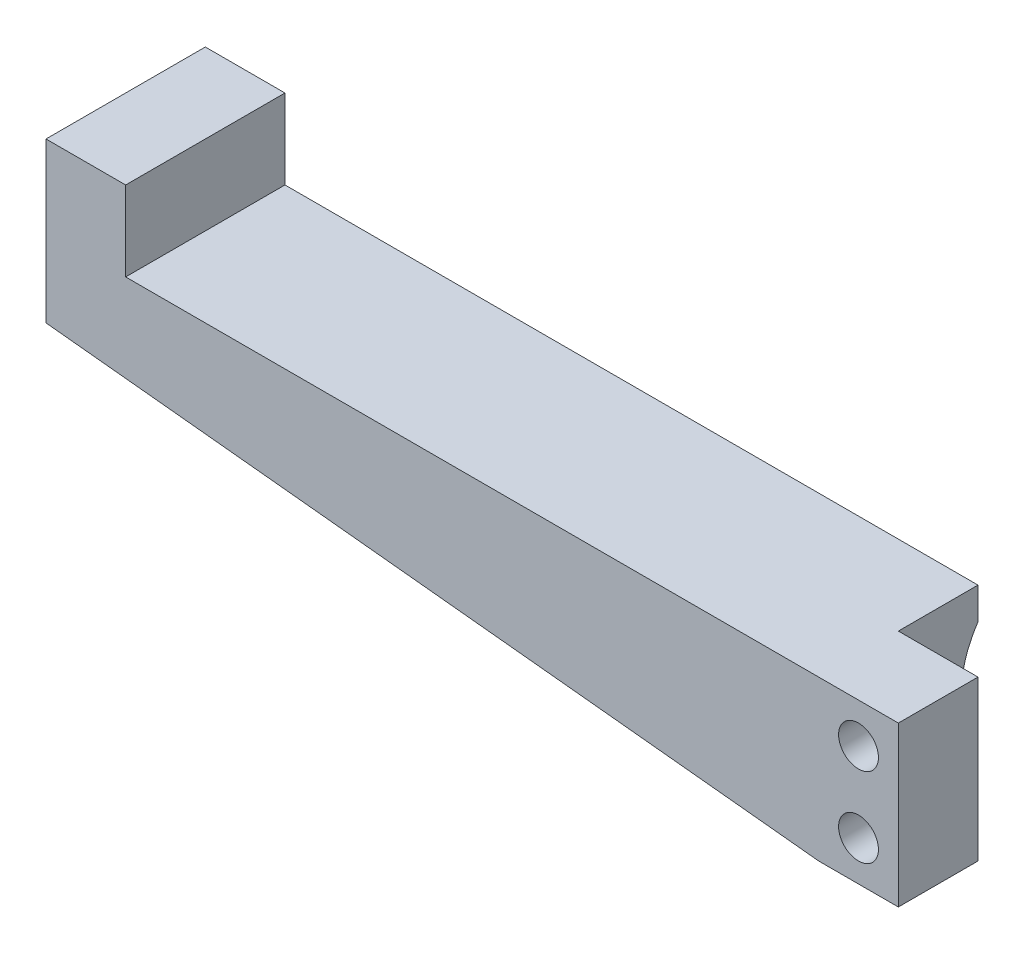
ISO-10303-21;
HEADER;
FILE_DESCRIPTION(('STEP AP214'),'2;1');
FILE_NAME('part.step','',(''),(''),'','','');
FILE_SCHEMA(('AUTOMOTIVE_DESIGN { 1 0 10303 214 1 1 1 1 }'));
ENDSEC;
DATA;
#1=APPLICATION_CONTEXT('core data for automotive mechanical design processes');
#2=APPLICATION_PROTOCOL_DEFINITION('international standard','automotive_design',2000,#1);
#3=PRODUCT_CONTEXT('',#1,'mechanical');
#4=PRODUCT('Part','Part','',(#3));
#5=PRODUCT_RELATED_PRODUCT_CATEGORY('part','',(#4));
#6=PRODUCT_DEFINITION_FORMATION('','',#4);
#7=PRODUCT_DEFINITION_CONTEXT('part definition',#1,'design');
#8=PRODUCT_DEFINITION('design','',#6,#7);
#9=PRODUCT_DEFINITION_SHAPE('','',#8);
#10=(LENGTH_UNIT() NAMED_UNIT(*) SI_UNIT(.MILLI.,.METRE.));
#11=(NAMED_UNIT(*) PLANE_ANGLE_UNIT() SI_UNIT($,.RADIAN.));
#12=(NAMED_UNIT(*) SI_UNIT($,.STERADIAN.) SOLID_ANGLE_UNIT());
#13=UNCERTAINTY_MEASURE_WITH_UNIT(LENGTH_MEASURE(1.E-05),#10,'distance_accuracy_value','');
#14=(GEOMETRIC_REPRESENTATION_CONTEXT(3) GLOBAL_UNCERTAINTY_ASSIGNED_CONTEXT((#13)) GLOBAL_UNIT_ASSIGNED_CONTEXT((#10,
#11,#12)) REPRESENTATION_CONTEXT('',''));
#15=CARTESIAN_POINT('',(0.,0.,0.));
#16=DIRECTION('',(0.,0.,1.));
#17=DIRECTION('',(1.,0.,0.));
#18=AXIS2_PLACEMENT_3D('',#15,#16,#17);
#19=CARTESIAN_POINT('',(0.,0.,0.));
#20=DIRECTION('',(0.,0.,-1.));
#21=DIRECTION('',(-1.,0.,0.));
#22=AXIS2_PLACEMENT_3D('',#19,#20,#21);
#23=PLANE('',#22);
#24=DIRECTION('',(-1.,0.,0.));
#25=VECTOR('',#24,1.);
#26=CARTESIAN_POINT('',(7.16552506059645,-6.00000000000002,0.));
#27=LINE('',#26,#25);
#28=CARTESIAN_POINT('',(-5.,-6.00000000000002,0.));
#29=VERTEX_POINT('',#28);
#30=CARTESIAN_POINT('',(-43.7999999999992,-6.00000000000005,0.));
#31=VERTEX_POINT('',#30);
#32=EDGE_CURVE('E130',#29,#31,#27,.T.);
#33=ORIENTED_EDGE('',*,*,#32,.F.);
#34=DIRECTION('',(0.,1.,0.));
#35=VECTOR('',#34,1.);
#36=CARTESIAN_POINT('',(-5.,10.,0.));
#37=LINE('',#36,#35);
#38=CARTESIAN_POINT('',(-5.,-10.,0.));
#39=VERTEX_POINT('',#38);
#40=EDGE_CURVE('E199',#39,#29,#37,.T.);
#41=ORIENTED_EDGE('',*,*,#40,.F.);
#42=DIRECTION('',(0.99472792615428,-0.102549270737555,0.));
#43=VECTOR('',#42,1.);
#44=CARTESIAN_POINT('',(-102.,0.,0.));
#45=LINE('',#44,#43);
#46=EDGE_CURVE('E137',#31,#39,#45,.T.);
#47=ORIENTED_EDGE('',*,*,#46,.F.);
#48=EDGE_LOOP('',(#33,#41,#47));
#49=FACE_BOUND('',#48,.T.);
#50=ADVANCED_FACE('F33',(#49),#23,.T.);
#51=CARTESIAN_POINT('',(5.,-10.,20.));
#52=DIRECTION('',(-1.,0.,0.));
#53=DIRECTION('',(0.,0.,1.));
#54=AXIS2_PLACEMENT_3D('',#51,#52,#53);
#55=PLANE('',#54);
#56=DIRECTION('',(0.,-1.,0.));
#57=VECTOR('',#56,1.);
#58=CARTESIAN_POINT('',(5.,10.,10.));
#59=LINE('',#58,#57);
#60=CARTESIAN_POINT('',(5.,10.,10.));
#61=VERTEX_POINT('',#60);
#62=CARTESIAN_POINT('',(5.,-10.,10.));
#63=VERTEX_POINT('',#62);
#64=EDGE_CURVE('E57',#61,#63,#59,.T.);
#65=ORIENTED_EDGE('',*,*,#64,.F.);
#66=DIRECTION('',(0.,0.,-1.));
#67=VECTOR('',#66,1.);
#68=CARTESIAN_POINT('',(5.,10.,20.));
#69=LINE('',#68,#67);
#70=CARTESIAN_POINT('',(5.,10.,20.));
#71=VERTEX_POINT('',#70);
#72=EDGE_CURVE('E11',#71,#61,#69,.T.);
#73=ORIENTED_EDGE('',*,*,#72,.F.);
#74=DIRECTION('',(0.,1.,0.));
#75=VECTOR('',#74,1.);
#76=CARTESIAN_POINT('',(5.,-10.,20.));
#77=LINE('',#76,#75);
#78=CARTESIAN_POINT('',(5.,-10.,20.));
#79=VERTEX_POINT('',#78);
#80=EDGE_CURVE('E140',#79,#71,#77,.T.);
#81=ORIENTED_EDGE('',*,*,#80,.F.);
#82=DIRECTION('',(0.,0.,-1.));
#83=VECTOR('',#82,1.);
#84=CARTESIAN_POINT('',(5.,-10.,20.));
#85=LINE('',#84,#83);
#86=EDGE_CURVE('E146',#79,#63,#85,.T.);
#87=ORIENTED_EDGE('',*,*,#86,.T.);
#88=EDGE_LOOP('',(#65,#73,#81,#87));
#89=FACE_BOUND('',#88,.T.);
#90=ADVANCED_FACE('F35',(#89),#55,.F.);
#91=CARTESIAN_POINT('',(-5.,-10.,20.));
#92=DIRECTION('',(0.,1.,0.));
#93=DIRECTION('',(0.,0.,1.));
#94=AXIS2_PLACEMENT_3D('',#91,#92,#93);
#95=PLANE('',#94);
#96=DIRECTION('',(-1.,0.,0.));
#97=VECTOR('',#96,1.);
#98=CARTESIAN_POINT('',(5.,-10.,10.));
#99=LINE('',#98,#97);
#100=CARTESIAN_POINT('',(-5.,-10.,10.));
#101=VERTEX_POINT('',#100);
#102=EDGE_CURVE('E206',#63,#101,#99,.T.);
#103=ORIENTED_EDGE('',*,*,#102,.F.);
#104=ORIENTED_EDGE('',*,*,#86,.F.);
#105=DIRECTION('',(1.,0.,0.));
#106=VECTOR('',#105,1.);
#107=CARTESIAN_POINT('',(-5.,-10.,20.));
#108=LINE('',#107,#106);
#109=CARTESIAN_POINT('',(-5.,-10.,20.));
#110=VERTEX_POINT('',#109);
#111=EDGE_CURVE('E150',#110,#79,#108,.T.);
#112=ORIENTED_EDGE('',*,*,#111,.F.);
#113=DIRECTION('',(0.,0.,-1.));
#114=VECTOR('',#113,1.);
#115=CARTESIAN_POINT('',(-5.,-10.,20.));
#116=LINE('',#115,#114);
#117=EDGE_CURVE('E149',#110,#101,#116,.T.);
#118=ORIENTED_EDGE('',*,*,#117,.T.);
#119=EDGE_LOOP('',(#103,#104,#112,#118));
#120=FACE_BOUND('',#119,.T.);
#121=ADVANCED_FACE('F252',(#120),#95,.F.);
#122=CARTESIAN_POINT('',(0.,5.,20.));
#123=DIRECTION('',(0.,0.,-1.));
#124=DIRECTION('',(-1.,0.,0.));
#125=AXIS2_PLACEMENT_3D('',#122,#123,#124);
#126=CYLINDRICAL_SURFACE('',#125,2.5);
#127=CARTESIAN_POINT('',(0.,5.,20.));
#128=DIRECTION('',(0.,0.,1.));
#129=DIRECTION('',(1.,0.,0.));
#130=AXIS2_PLACEMENT_3D('',#127,#128,#129);
#131=CIRCLE('',#130,2.5);
#132=CARTESIAN_POINT('',(2.5,5.,20.));
#133=VERTEX_POINT('',#132);
#134=EDGE_CURVE('E169',#133,#133,#131,.T.);
#135=ORIENTED_EDGE('',*,*,#134,.T.);
#136=EDGE_LOOP('',(#135));
#137=FACE_BOUND('',#136,.T.);
#138=CARTESIAN_POINT('',(0.,5.,10.));
#139=DIRECTION('',(0.,0.,-1.));
#140=DIRECTION('',(-1.,0.,0.));
#141=AXIS2_PLACEMENT_3D('',#138,#139,#140);
#142=CIRCLE('',#141,2.5);
#143=CARTESIAN_POINT('',(-2.5,5.,10.));
#144=VERTEX_POINT('',#143);
#145=EDGE_CURVE('E189',#144,#144,#142,.T.);
#146=ORIENTED_EDGE('',*,*,#145,.T.);
#147=EDGE_LOOP('',(#146));
#148=FACE_BOUND('',#147,.T.);
#149=ADVANCED_FACE('F286',(#137,#148),#126,.F.);
#150=CARTESIAN_POINT('',(0.,-5.,20.));
#151=DIRECTION('',(0.,0.,-1.));
#152=DIRECTION('',(-1.,0.,0.));
#153=AXIS2_PLACEMENT_3D('',#150,#151,#152);
#154=CYLINDRICAL_SURFACE('',#153,2.5);
#155=CARTESIAN_POINT('',(0.,-5.,20.));
#156=DIRECTION('',(0.,0.,1.));
#157=DIRECTION('',(1.,0.,0.));
#158=AXIS2_PLACEMENT_3D('',#155,#156,#157);
#159=CIRCLE('',#158,2.5);
#160=CARTESIAN_POINT('',(2.5,-5.,20.));
#161=VERTEX_POINT('',#160);
#162=EDGE_CURVE('E186',#161,#161,#159,.T.);
#163=ORIENTED_EDGE('',*,*,#162,.T.);
#164=EDGE_LOOP('',(#163));
#165=FACE_BOUND('',#164,.T.);
#166=CARTESIAN_POINT('',(0.,-5.,10.));
#167=DIRECTION('',(0.,0.,-1.));
#168=DIRECTION('',(-1.,0.,0.));
#169=AXIS2_PLACEMENT_3D('',#166,#167,#168);
#170=CIRCLE('',#169,2.5);
#171=CARTESIAN_POINT('',(-2.5,-5.,10.));
#172=VERTEX_POINT('',#171);
#173=EDGE_CURVE('E37',#172,#172,#170,.T.);
#174=ORIENTED_EDGE('',*,*,#173,.T.);
#175=EDGE_LOOP('',(#174));
#176=FACE_BOUND('',#175,.T.);
#177=ADVANCED_FACE('F282',(#165,#176),#154,.F.);
#178=CARTESIAN_POINT('',(0.,0.,20.));
#179=DIRECTION('',(0.,0.,-1.));
#180=DIRECTION('',(-1.,0.,0.));
#181=AXIS2_PLACEMENT_3D('',#178,#179,#180);
#182=PLANE('',#181);
#183=ORIENTED_EDGE('',*,*,#80,.T.);
#184=DIRECTION('',(-1.,0.,0.));
#185=VECTOR('',#184,1.);
#186=CARTESIAN_POINT('',(-5.,10.,20.));
#187=LINE('',#186,#185);
#188=CARTESIAN_POINT('',(-92.,9.99999999999999,20.));
#189=VERTEX_POINT('',#188);
#190=EDGE_CURVE('E180',#71,#189,#187,.T.);
#191=ORIENTED_EDGE('',*,*,#190,.T.);
#192=DIRECTION('',(0.,1.,0.));
#193=VECTOR('',#192,1.);
#194=CARTESIAN_POINT('',(-92.,9.99999999999999,20.));
#195=LINE('',#194,#193);
#196=CARTESIAN_POINT('',(-92.,20.,20.));
#197=VERTEX_POINT('',#196);
#198=EDGE_CURVE('E166',#189,#197,#195,.T.);
#199=ORIENTED_EDGE('',*,*,#198,.T.);
#200=DIRECTION('',(-1.,0.,0.));
#201=VECTOR('',#200,1.);
#202=CARTESIAN_POINT('',(-102.,20.,20.));
#203=LINE('',#202,#201);
#204=CARTESIAN_POINT('',(-102.,20.,20.));
#205=VERTEX_POINT('',#204);
#206=EDGE_CURVE('E177',#197,#205,#203,.T.);
#207=ORIENTED_EDGE('',*,*,#206,.T.);
#208=DIRECTION('',(0.,-1.,0.));
#209=VECTOR('',#208,1.);
#210=CARTESIAN_POINT('',(-102.,9.99999999999999,20.));
#211=LINE('',#210,#209);
#212=CARTESIAN_POINT('',(-102.,0.,20.));
#213=VERTEX_POINT('',#212);
#214=EDGE_CURVE('E175',#205,#213,#211,.T.);
#215=ORIENTED_EDGE('',*,*,#214,.T.);
#216=DIRECTION('',(0.99472792615428,-0.102549270737555,0.));
#217=VECTOR('',#216,1.);
#218=CARTESIAN_POINT('',(-102.,0.,20.));
#219=LINE('',#218,#217);
#220=EDGE_CURVE('E173',#213,#110,#219,.T.);
#221=ORIENTED_EDGE('',*,*,#220,.T.);
#222=ORIENTED_EDGE('',*,*,#111,.T.);
#223=EDGE_LOOP('',(#183,#191,#199,#207,#215,#221,#222));
#224=FACE_BOUND('',#223,.T.);
#225=ORIENTED_EDGE('',*,*,#134,.F.);
#226=EDGE_LOOP('',(#225));
#227=FACE_BOUND('',#226,.T.);
#228=ORIENTED_EDGE('',*,*,#162,.F.);
#229=EDGE_LOOP('',(#228));
#230=FACE_BOUND('',#229,.T.);
#231=ADVANCED_FACE('F256',(#224,#227,#230),#182,.F.);
#232=DIRECTION('',(-1.,0.,0.));
#233=VECTOR('',#232,1.);
#234=CARTESIAN_POINT('',(7.16552506059645,5.99999999999998,0.));
#235=LINE('',#234,#233);
#236=CARTESIAN_POINT('',(-5.,5.99999999999998,0.));
#237=VERTEX_POINT('',#236);
#238=CARTESIAN_POINT('',(-102.,5.99999999999998,0.));
#239=VERTEX_POINT('',#238);
#240=EDGE_CURVE('E49',#237,#239,#235,.T.);
#241=ORIENTED_EDGE('',*,*,#240,.T.);
#242=DIRECTION('',(0.,-1.,0.));
#243=VECTOR('',#242,1.);
#244=CARTESIAN_POINT('',(-102.,9.99999999999999,0.));
#245=LINE('',#244,#243);
#246=CARTESIAN_POINT('',(-102.,20.,0.));
#247=VERTEX_POINT('',#246);
#248=EDGE_CURVE('E126',#247,#239,#245,.T.);
#249=ORIENTED_EDGE('',*,*,#248,.F.);
#250=DIRECTION('',(-1.,0.,0.));
#251=VECTOR('',#250,1.);
#252=CARTESIAN_POINT('',(-102.,20.,0.));
#253=LINE('',#252,#251);
#254=CARTESIAN_POINT('',(-92.,20.,0.));
#255=VERTEX_POINT('',#254);
#256=EDGE_CURVE('E138',#255,#247,#253,.T.);
#257=ORIENTED_EDGE('',*,*,#256,.F.);
#258=DIRECTION('',(0.,1.,0.));
#259=VECTOR('',#258,1.);
#260=CARTESIAN_POINT('',(-92.,9.99999999999999,0.));
#261=LINE('',#260,#259);
#262=CARTESIAN_POINT('',(-92.,9.99999999999999,0.));
#263=VERTEX_POINT('',#262);
#264=EDGE_CURVE('E142',#263,#255,#261,.T.);
#265=ORIENTED_EDGE('',*,*,#264,.F.);
#266=DIRECTION('',(-1.,0.,0.));
#267=VECTOR('',#266,1.);
#268=CARTESIAN_POINT('',(-5.,10.,0.));
#269=LINE('',#268,#267);
#270=CARTESIAN_POINT('',(-5.,10.,0.));
#271=VERTEX_POINT('',#270);
#272=EDGE_CURVE('E168',#271,#263,#269,.T.);
#273=ORIENTED_EDGE('',*,*,#272,.F.);
#274=EDGE_CURVE('E129',#237,#271,#37,.T.);
#275=ORIENTED_EDGE('',*,*,#274,.F.);
#276=EDGE_LOOP('',(#241,#249,#257,#265,#273,#275));
#277=FACE_BOUND('',#276,.T.);
#278=ADVANCED_FACE('F124',(#277),#23,.T.);
#279=CARTESIAN_POINT('',(-5.,10.,20.));
#280=DIRECTION('',(0.,-1.,0.));
#281=DIRECTION('',(1.,0.,0.));
#282=AXIS2_PLACEMENT_3D('',#279,#280,#281);
#283=PLANE('',#282);
#284=DIRECTION('',(1.,0.,0.));
#285=VECTOR('',#284,1.);
#286=CARTESIAN_POINT('',(5.,10.,10.));
#287=LINE('',#286,#285);
#288=CARTESIAN_POINT('',(-5.,10.,10.));
#289=VERTEX_POINT('',#288);
#290=EDGE_CURVE('E196',#289,#61,#287,.T.);
#291=ORIENTED_EDGE('',*,*,#290,.F.);
#292=DIRECTION('',(0.,0.,-1.));
#293=VECTOR('',#292,1.);
#294=CARTESIAN_POINT('',(-5.,10.,10.));
#295=LINE('',#294,#293);
#296=EDGE_CURVE('E195',#289,#271,#295,.T.);
#297=ORIENTED_EDGE('',*,*,#296,.T.);
#298=ORIENTED_EDGE('',*,*,#272,.T.);
#299=DIRECTION('',(0.,0.,-1.));
#300=VECTOR('',#299,1.);
#301=CARTESIAN_POINT('',(-92.,9.99999999999999,20.));
#302=LINE('',#301,#300);
#303=EDGE_CURVE('E42',#189,#263,#302,.T.);
#304=ORIENTED_EDGE('',*,*,#303,.F.);
#305=ORIENTED_EDGE('',*,*,#190,.F.);
#306=ORIENTED_EDGE('',*,*,#72,.T.);
#307=EDGE_LOOP('',(#291,#297,#298,#304,#305,#306));
#308=FACE_BOUND('',#307,.T.);
#309=ADVANCED_FACE('F268',(#308),#283,.F.);
#310=CARTESIAN_POINT('',(-92.,9.99999999999999,20.));
#311=DIRECTION('',(-1.,0.,0.));
#312=DIRECTION('',(0.,0.,1.));
#313=AXIS2_PLACEMENT_3D('',#310,#311,#312);
#314=PLANE('',#313);
#315=ORIENTED_EDGE('',*,*,#264,.T.);
#316=DIRECTION('',(0.,0.,-1.));
#317=VECTOR('',#316,1.);
#318=CARTESIAN_POINT('',(-92.,20.,20.));
#319=LINE('',#318,#317);
#320=EDGE_CURVE('E156',#197,#255,#319,.T.);
#321=ORIENTED_EDGE('',*,*,#320,.F.);
#322=ORIENTED_EDGE('',*,*,#198,.F.);
#323=ORIENTED_EDGE('',*,*,#303,.T.);
#324=EDGE_LOOP('',(#315,#321,#322,#323));
#325=FACE_BOUND('',#324,.T.);
#326=ADVANCED_FACE('F164',(#325),#314,.F.);
#327=CARTESIAN_POINT('',(-102.,20.,20.));
#328=DIRECTION('',(0.,-1.,0.));
#329=DIRECTION('',(0.,0.,-1.));
#330=AXIS2_PLACEMENT_3D('',#327,#328,#329);
#331=PLANE('',#330);
#332=ORIENTED_EDGE('',*,*,#256,.T.);
#333=DIRECTION('',(0.,0.,-1.));
#334=VECTOR('',#333,1.);
#335=CARTESIAN_POINT('',(-102.,20.,20.));
#336=LINE('',#335,#334);
#337=EDGE_CURVE('E136',#205,#247,#336,.T.);
#338=ORIENTED_EDGE('',*,*,#337,.F.);
#339=ORIENTED_EDGE('',*,*,#206,.F.);
#340=ORIENTED_EDGE('',*,*,#320,.T.);
#341=EDGE_LOOP('',(#332,#338,#339,#340));
#342=FACE_BOUND('',#341,.T.);
#343=ADVANCED_FACE('F261',(#342),#331,.F.);
#344=CARTESIAN_POINT('',(-102.,9.99999999999999,20.));
#345=DIRECTION('',(1.,0.,0.));
#346=DIRECTION('',(0.,0.,-1.));
#347=AXIS2_PLACEMENT_3D('',#344,#345,#346);
#348=PLANE('',#347);
#349=ORIENTED_EDGE('',*,*,#248,.T.);
#350=CARTESIAN_POINT('',(-102.,-6.00000000000002,0.));
#351=CARTESIAN_POINT('',(-102.,0.,4.));
#352=CARTESIAN_POINT('',(-102.,5.99999999999998,0.));
#353=B_SPLINE_CURVE_WITH_KNOTS('',2,(#350,#351,#352),.UNSPECIFIED.,.F.,.F.,(3,3),(0.,1.),.UNSPECIFIED.);
#354=CARTESIAN_POINT('',(-102.,0.,2.));
#355=VERTEX_POINT('',#354);
#356=EDGE_CURVE('E113',#355,#239,#353,.T.);
#357=ORIENTED_EDGE('',*,*,#356,.F.);
#358=DIRECTION('',(0.,0.,-1.));
#359=VECTOR('',#358,1.);
#360=CARTESIAN_POINT('',(-102.,0.,20.));
#361=LINE('',#360,#359);
#362=EDGE_CURVE('E153',#213,#355,#361,.T.);
#363=ORIENTED_EDGE('',*,*,#362,.F.);
#364=ORIENTED_EDGE('',*,*,#214,.F.);
#365=ORIENTED_EDGE('',*,*,#337,.T.);
#366=EDGE_LOOP('',(#349,#357,#363,#364,#365));
#367=FACE_BOUND('',#366,.T.);
#368=ADVANCED_FACE('F133',(#367),#348,.F.);
#369=CARTESIAN_POINT('',(-102.,0.,20.));
#370=DIRECTION('',(0.102549270737555,0.994727926154281,0.));
#371=DIRECTION('',(-0.994727926154281,0.102549270737555,0.));
#372=AXIS2_PLACEMENT_3D('',#369,#370,#371);
#373=PLANE('',#372);
#374=ORIENTED_EDGE('',*,*,#362,.T.);
#375=CARTESIAN_POINT('',(-102.,0.,2.));
#376=CARTESIAN_POINT('',(-99.0153032523588,-0.307700695633131,2.00000044377069));
#377=CARTESIAN_POINT('',(-96.0306446478674,-0.61539745898276,1.98421937446989));
#378=CARTESIAN_POINT('',(-90.0621925734618,-1.23070179655034,1.92111166832285));
#379=CARTESIAN_POINT('',(-87.0783990443765,-1.53830937686841,1.87379068736831));
#380=CARTESIAN_POINT('',(-77.3746621959954,-2.53869461896956,1.66860876139103));
#381=CARTESIAN_POINT('',(-70.655907610372,-3.23134973088949,1.44653132129678));
#382=CARTESIAN_POINT('',(-60.5819369676393,-4.26990340539802,0.993770209075332));
#383=CARTESIAN_POINT('',(-57.2239252388865,-4.6160901815581,0.822859839457878));
#384=CARTESIAN_POINT('',(-50.5101740441958,-5.30822947997983,0.441247917660142));
#385=CARTESIAN_POINT('',(-47.154434555358,-5.65418200460227,0.230546772667943));
#386=CARTESIAN_POINT('',(-43.7999999999999,-6.00000000000002,0.));
#387=B_SPLINE_CURVE_WITH_KNOTS('',3,(#375,#376,#377,#378,#379,#380,#381,#382,#383,#384,#385,
#386),.UNSPECIFIED.,.F.,.F.,(4,2,2,2,2,4),(0.,9.00142892731478,18.0012441083682,
38.2730186694755,48.4132280563897,58.5533336818497),.UNSPECIFIED.);
#388=EDGE_CURVE('E116',#355,#31,#387,.T.);
#389=ORIENTED_EDGE('',*,*,#388,.T.);
#390=ORIENTED_EDGE('',*,*,#46,.T.);
#391=DIRECTION('',(0.,0.,-1.));
#392=VECTOR('',#391,1.);
#393=CARTESIAN_POINT('',(-5.,-10.,10.));
#394=LINE('',#393,#392);
#395=EDGE_CURVE('E192',#101,#39,#394,.T.);
#396=ORIENTED_EDGE('',*,*,#395,.F.);
#397=ORIENTED_EDGE('',*,*,#117,.F.);
#398=ORIENTED_EDGE('',*,*,#220,.F.);
#399=EDGE_LOOP('',(#374,#389,#390,#396,#397,#398));
#400=FACE_BOUND('',#399,.T.);
#401=ADVANCED_FACE('F216',(#400),#373,.F.);
#402=CARTESIAN_POINT('',(-5.,10.,10.));
#403=DIRECTION('',(-1.,0.,0.));
#404=DIRECTION('',(0.,0.,1.));
#405=AXIS2_PLACEMENT_3D('',#402,#403,#404);
#406=PLANE('',#405);
#407=ORIENTED_EDGE('',*,*,#40,.T.);
#408=CARTESIAN_POINT('',(-5.,-6.00000000000002,0.));
#409=CARTESIAN_POINT('',(-5.,0.,4.));
#410=CARTESIAN_POINT('',(-5.,5.99999999999998,0.));
#411=B_SPLINE_CURVE_WITH_KNOTS('',2,(#408,#409,#410),.UNSPECIFIED.,.F.,.F.,(3,3),(0.,1.),.UNSPECIFIED.);
#412=EDGE_CURVE('E214',#237,#29,#411,.F.);
#413=ORIENTED_EDGE('',*,*,#412,.F.);
#414=ORIENTED_EDGE('',*,*,#274,.T.);
#415=ORIENTED_EDGE('',*,*,#296,.F.);
#416=DIRECTION('',(0.,1.,0.));
#417=VECTOR('',#416,1.);
#418=CARTESIAN_POINT('',(-5.,10.,10.));
#419=LINE('',#418,#417);
#420=EDGE_CURVE('E203',#101,#289,#419,.T.);
#421=ORIENTED_EDGE('',*,*,#420,.F.);
#422=ORIENTED_EDGE('',*,*,#395,.T.);
#423=EDGE_LOOP('',(#407,#413,#414,#415,#421,#422));
#424=FACE_BOUND('',#423,.T.);
#425=ADVANCED_FACE('F245',(#424),#406,.F.);
#426=CARTESIAN_POINT('',(0.,0.,10.));
#427=DIRECTION('',(0.,0.,-1.));
#428=DIRECTION('',(-1.,0.,0.));
#429=AXIS2_PLACEMENT_3D('',#426,#427,#428);
#430=PLANE('',#429);
#431=ORIENTED_EDGE('',*,*,#145,.F.);
#432=EDGE_LOOP('',(#431));
#433=FACE_BOUND('',#432,.T.);
#434=ORIENTED_EDGE('',*,*,#173,.F.);
#435=EDGE_LOOP('',(#434));
#436=FACE_BOUND('',#435,.T.);
#437=ORIENTED_EDGE('',*,*,#64,.T.);
#438=ORIENTED_EDGE('',*,*,#102,.T.);
#439=ORIENTED_EDGE('',*,*,#420,.T.);
#440=ORIENTED_EDGE('',*,*,#290,.T.);
#441=EDGE_LOOP('',(#437,#438,#439,#440));
#442=FACE_BOUND('',#441,.T.);
#443=ADVANCED_FACE('F224',(#433,#436,#442),#430,.T.);
#444=CARTESIAN_POINT('',(7.16552506059645,-6.00000000000002,0.));
#445=CARTESIAN_POINT('',(7.16552506059645,0.,4.));
#446=CARTESIAN_POINT('',(7.16552506059645,5.99999999999998,0.));
#447=B_SPLINE_CURVE_WITH_KNOTS('',2,(#444,#445,#446),.UNSPECIFIED.,.F.,.F.,(3,3),(0.,1.),.UNSPECIFIED.);
#448=DIRECTION('',(-1.,0.,0.));
#449=VECTOR('',#448,1.);
#450=SURFACE_OF_LINEAR_EXTRUSION('',#447,#449);
#451=ORIENTED_EDGE('',*,*,#356,.T.);
#452=ORIENTED_EDGE('',*,*,#240,.F.);
#453=ORIENTED_EDGE('',*,*,#412,.T.);
#454=ORIENTED_EDGE('',*,*,#32,.T.);
#455=ORIENTED_EDGE('',*,*,#388,.F.);
#456=EDGE_LOOP('',(#451,#452,#453,#454,#455));
#457=FACE_BOUND('',#456,.T.);
#458=ADVANCED_FACE('F114',(#457),#450,.F.);
#459=CLOSED_SHELL('',(#50,#90,#121,#149,#177,#231,#278,#309,#326,#343,#368,#401,#425,#443,#458));
#460=MANIFOLD_SOLID_BREP('B2',#459);
#461=ADVANCED_BREP_SHAPE_REPRESENTATION('',(#18,#460),#14);
#462=SHAPE_DEFINITION_REPRESENTATION(#9,#461);
ENDSEC;
END-ISO-10303-21;
